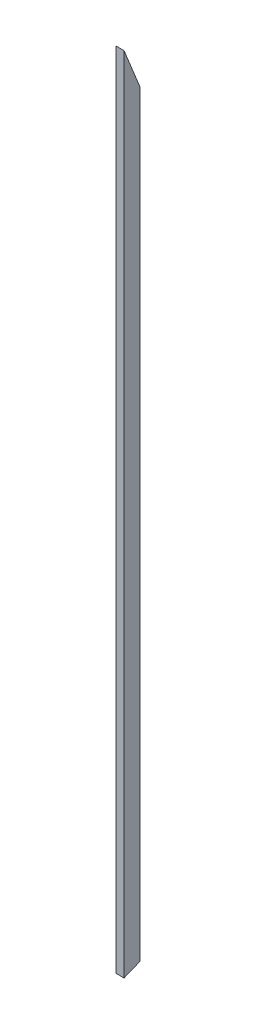
ISO-10303-21;
HEADER;
FILE_DESCRIPTION(('STEP AP214'),'2;1');
FILE_NAME('part.step','',(''),(''),'','','');
FILE_SCHEMA(('AUTOMOTIVE_DESIGN { 1 0 10303 214 1 1 1 1 }'));
ENDSEC;
DATA;
#1=APPLICATION_CONTEXT('core data for automotive mechanical design processes');
#2=APPLICATION_PROTOCOL_DEFINITION('international standard','automotive_design',2000,#1);
#3=PRODUCT_CONTEXT('',#1,'mechanical');
#4=PRODUCT('Part','Part','',(#3));
#5=PRODUCT_RELATED_PRODUCT_CATEGORY('part','',(#4));
#6=PRODUCT_DEFINITION_FORMATION('','',#4);
#7=PRODUCT_DEFINITION_CONTEXT('part definition',#1,'design');
#8=PRODUCT_DEFINITION('design','',#6,#7);
#9=PRODUCT_DEFINITION_SHAPE('','',#8);
#10=(LENGTH_UNIT() NAMED_UNIT(*) SI_UNIT(.MILLI.,.METRE.));
#11=(NAMED_UNIT(*) PLANE_ANGLE_UNIT() SI_UNIT($,.RADIAN.));
#12=(NAMED_UNIT(*) SI_UNIT($,.STERADIAN.) SOLID_ANGLE_UNIT());
#13=UNCERTAINTY_MEASURE_WITH_UNIT(LENGTH_MEASURE(1.E-05),#10,'distance_accuracy_value','');
#14=(GEOMETRIC_REPRESENTATION_CONTEXT(3) GLOBAL_UNCERTAINTY_ASSIGNED_CONTEXT((#13)) GLOBAL_UNIT_ASSIGNED_CONTEXT((#10,
#11,#12)) REPRESENTATION_CONTEXT('',''));
#15=CARTESIAN_POINT('',(0.,0.,0.));
#16=DIRECTION('',(0.,0.,1.));
#17=DIRECTION('',(1.,0.,0.));
#18=AXIS2_PLACEMENT_3D('',#15,#16,#17);
#19=CARTESIAN_POINT('',(-12.5,2534.75837113,-25.));
#20=DIRECTION('',(1.,0.,0.));
#21=DIRECTION('',(0.,0.,-1.));
#22=AXIS2_PLACEMENT_3D('',#19,#20,#21);
#23=PLANE('',#22);
#24=DIRECTION('',(0.,-1.,0.));
#25=VECTOR('',#24,1.);
#26=CARTESIAN_POINT('',(-12.5,2534.75837113,-25.));
#27=LINE('',#26,#25);
#28=CARTESIAN_POINT('',(-12.5000000000002,2411.0741606,-25.));
#29=VERTEX_POINT('',#28);
#30=CARTESIAN_POINT('',(-12.5000000000002,20.21276596,-25.));
#31=VERTEX_POINT('',#30);
#32=EDGE_CURVE('E106',#29,#31,#27,.T.);
#33=ORIENTED_EDGE('',*,*,#32,.T.);
#34=DIRECTION('',(0.,-0.374789175538116,0.927110065687704));
#35=VECTOR('',#34,1.);
#36=CARTESIAN_POINT('',(-12.5,373.423257657854,-898.731216194851));
#37=LINE('',#36,#35);
#38=CARTESIAN_POINT('',(-12.5000000000002,0.,25.));
#39=VERTEX_POINT('',#38);
#40=EDGE_CURVE('E85',#31,#39,#37,.T.);
#41=ORIENTED_EDGE('',*,*,#40,.T.);
#42=DIRECTION('',(0.,-1.,0.));
#43=VECTOR('',#42,1.);
#44=CARTESIAN_POINT('',(-12.5,2534.75837113,25.));
#45=LINE('',#44,#43);
#46=CARTESIAN_POINT('',(-12.5,2534.75837113,25.));
#47=VERTEX_POINT('',#46);
#48=EDGE_CURVE('E11',#47,#39,#45,.T.);
#49=ORIENTED_EDGE('',*,*,#48,.F.);
#50=DIRECTION('',(0.,-0.927110065708033,-0.374789175487828));
#51=VECTOR('',#50,1.);
#52=CARTESIAN_POINT('',(-12.5,2517.38483027434,17.9766536968577));
#53=LINE('',#52,#51);
#54=EDGE_CURVE('E58',#47,#29,#53,.T.);
#55=ORIENTED_EDGE('',*,*,#54,.T.);
#56=EDGE_LOOP('',(#33,#41,#49,#55));
#57=FACE_BOUND('',#56,.T.);
#58=ADVANCED_FACE('F43',(#57),#23,.F.);
#59=CARTESIAN_POINT('',(12.5,2534.75837113,25.));
#60=DIRECTION('',(0.,0.,-1.));
#61=DIRECTION('',(-1.,0.,0.));
#62=AXIS2_PLACEMENT_3D('',#59,#60,#61);
#63=PLANE('',#62);
#64=DIRECTION('',(1.,0.,0.));
#65=VECTOR('',#64,1.);
#66=CARTESIAN_POINT('',(12.5,0.,25.));
#67=LINE('',#66,#65);
#68=CARTESIAN_POINT('',(12.5,0.,25.));
#69=VERTEX_POINT('',#68);
#70=EDGE_CURVE('E113',#39,#69,#67,.T.);
#71=ORIENTED_EDGE('',*,*,#70,.T.);
#72=DIRECTION('',(0.,-1.,0.));
#73=VECTOR('',#72,1.);
#74=CARTESIAN_POINT('',(12.5,2534.75837113,25.));
#75=LINE('',#74,#73);
#76=CARTESIAN_POINT('',(12.5,2534.75837113,25.));
#77=VERTEX_POINT('',#76);
#78=EDGE_CURVE('E52',#77,#69,#75,.T.);
#79=ORIENTED_EDGE('',*,*,#78,.F.);
#80=DIRECTION('',(1.,0.,0.));
#81=VECTOR('',#80,1.);
#82=CARTESIAN_POINT('',(12.5,2534.75837113,25.));
#83=LINE('',#82,#81);
#84=EDGE_CURVE('E110',#47,#77,#83,.T.);
#85=ORIENTED_EDGE('',*,*,#84,.F.);
#86=ORIENTED_EDGE('',*,*,#48,.T.);
#87=EDGE_LOOP('',(#71,#79,#85,#86));
#88=FACE_BOUND('',#87,.T.);
#89=ADVANCED_FACE('F127',(#88),#63,.F.);
#90=CARTESIAN_POINT('',(12.5,2534.75837113,-25.));
#91=DIRECTION('',(-1.,0.,0.));
#92=DIRECTION('',(0.,0.,1.));
#93=AXIS2_PLACEMENT_3D('',#90,#91,#92);
#94=PLANE('',#93);
#95=ORIENTED_EDGE('',*,*,#78,.T.);
#96=DIRECTION('',(0.,-0.374789175538116,0.927110065687704));
#97=VECTOR('',#96,1.);
#98=CARTESIAN_POINT('',(12.5,20.21276596,-25.));
#99=LINE('',#98,#97);
#100=CARTESIAN_POINT('',(12.5,20.21276596,-25.));
#101=VERTEX_POINT('',#100);
#102=EDGE_CURVE('E82',#101,#69,#99,.T.);
#103=ORIENTED_EDGE('',*,*,#102,.F.);
#104=DIRECTION('',(0.,-1.,0.));
#105=VECTOR('',#104,1.);
#106=CARTESIAN_POINT('',(12.5,2534.75837113,-25.));
#107=LINE('',#106,#105);
#108=CARTESIAN_POINT('',(12.5,2411.0741606,-25.));
#109=VERTEX_POINT('',#108);
#110=EDGE_CURVE('E97',#109,#101,#107,.T.);
#111=ORIENTED_EDGE('',*,*,#110,.F.);
#112=DIRECTION('',(0.,-0.927110065708033,-0.374789175487828));
#113=VECTOR('',#112,1.);
#114=CARTESIAN_POINT('',(12.5,2411.0741606,-25.));
#115=LINE('',#114,#113);
#116=EDGE_CURVE('E100',#77,#109,#115,.T.);
#117=ORIENTED_EDGE('',*,*,#116,.F.);
#118=EDGE_LOOP('',(#95,#103,#111,#117));
#119=FACE_BOUND('',#118,.T.);
#120=ADVANCED_FACE('F95',(#119),#94,.F.);
#121=CARTESIAN_POINT('',(12.5,2534.75837113,-25.));
#122=DIRECTION('',(0.,0.,1.));
#123=DIRECTION('',(1.,0.,0.));
#124=AXIS2_PLACEMENT_3D('',#121,#122,#123);
#125=PLANE('',#124);
#126=ORIENTED_EDGE('',*,*,#110,.T.);
#127=DIRECTION('',(1.,0.,0.));
#128=VECTOR('',#127,1.);
#129=CARTESIAN_POINT('',(-2522.25837113,20.21276596,-25.));
#130=LINE('',#129,#128);
#131=EDGE_CURVE('E79',#31,#101,#130,.T.);
#132=ORIENTED_EDGE('',*,*,#131,.F.);
#133=ORIENTED_EDGE('',*,*,#32,.F.);
#134=DIRECTION('',(1.,0.,0.));
#135=VECTOR('',#134,1.);
#136=CARTESIAN_POINT('',(-2522.25837113,2411.0741606,-25.));
#137=LINE('',#136,#135);
#138=EDGE_CURVE('E104',#29,#109,#137,.T.);
#139=ORIENTED_EDGE('',*,*,#138,.T.);
#140=EDGE_LOOP('',(#126,#132,#133,#139));
#141=FACE_BOUND('',#140,.T.);
#142=ADVANCED_FACE('F103',(#141),#125,.F.);
#143=CARTESIAN_POINT('',(-2522.25837113,20.21276596,-25.));
#144=DIRECTION('',(0.,0.927110065687704,0.374789175538116));
#145=DIRECTION('',(0.,-0.374789175538116,0.927110065687704));
#146=AXIS2_PLACEMENT_3D('',#143,#144,#145);
#147=PLANE('',#146);
#148=ORIENTED_EDGE('',*,*,#131,.T.);
#149=ORIENTED_EDGE('',*,*,#102,.T.);
#150=ORIENTED_EDGE('',*,*,#70,.F.);
#151=ORIENTED_EDGE('',*,*,#40,.F.);
#152=EDGE_LOOP('',(#148,#149,#150,#151));
#153=FACE_BOUND('',#152,.T.);
#154=ADVANCED_FACE('F81',(#153),#147,.F.);
#155=CARTESIAN_POINT('',(-2522.25837113,2411.0741606,-25.));
#156=DIRECTION('',(0.,-0.374789175487828,0.927110065708033));
#157=DIRECTION('',(0.,-0.927110065708033,-0.374789175487828));
#158=AXIS2_PLACEMENT_3D('',#155,#156,#157);
#159=PLANE('',#158);
#160=ORIENTED_EDGE('',*,*,#84,.T.);
#161=ORIENTED_EDGE('',*,*,#116,.T.);
#162=ORIENTED_EDGE('',*,*,#138,.F.);
#163=ORIENTED_EDGE('',*,*,#54,.F.);
#164=EDGE_LOOP('',(#160,#161,#162,#163));
#165=FACE_BOUND('',#164,.T.);
#166=ADVANCED_FACE('F125',(#165),#159,.F.);
#167=CLOSED_SHELL('',(#58,#89,#120,#142,#154,#166));
#168=MANIFOLD_SOLID_BREP('B2',#167);
#169=ADVANCED_BREP_SHAPE_REPRESENTATION('',(#18,#168),#14);
#170=SHAPE_DEFINITION_REPRESENTATION(#9,#169);
ENDSEC;
END-ISO-10303-21;
